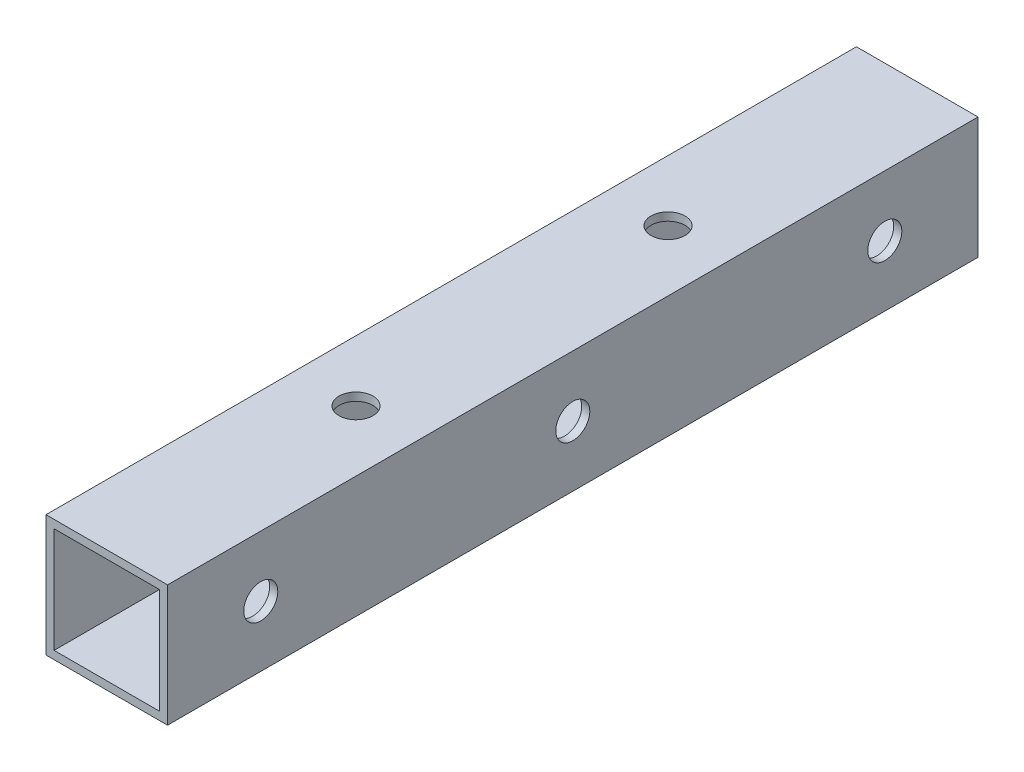
ISO-10303-21;
HEADER;
FILE_DESCRIPTION(('STEP AP214'),'2;1');
FILE_NAME('part.step','',(''),(''),'','','');
FILE_SCHEMA(('AUTOMOTIVE_DESIGN { 1 0 10303 214 1 1 1 1 }'));
ENDSEC;
DATA;
#1=APPLICATION_CONTEXT('core data for automotive mechanical design processes');
#2=APPLICATION_PROTOCOL_DEFINITION('international standard','automotive_design',2000,#1);
#3=PRODUCT_CONTEXT('',#1,'mechanical');
#4=PRODUCT('Part','Part','',(#3));
#5=PRODUCT_RELATED_PRODUCT_CATEGORY('part','',(#4));
#6=PRODUCT_DEFINITION_FORMATION('','',#4);
#7=PRODUCT_DEFINITION_CONTEXT('part definition',#1,'design');
#8=PRODUCT_DEFINITION('design','',#6,#7);
#9=PRODUCT_DEFINITION_SHAPE('','',#8);
#10=(LENGTH_UNIT() NAMED_UNIT(*) SI_UNIT(.MILLI.,.METRE.));
#11=(NAMED_UNIT(*) PLANE_ANGLE_UNIT() SI_UNIT($,.RADIAN.));
#12=(NAMED_UNIT(*) SI_UNIT($,.STERADIAN.) SOLID_ANGLE_UNIT());
#13=UNCERTAINTY_MEASURE_WITH_UNIT(LENGTH_MEASURE(1.E-05),#10,'distance_accuracy_value','');
#14=(GEOMETRIC_REPRESENTATION_CONTEXT(3) GLOBAL_UNCERTAINTY_ASSIGNED_CONTEXT((#13)) GLOBAL_UNIT_ASSIGNED_CONTEXT((#10,
#11,#12)) REPRESENTATION_CONTEXT('',''));
#15=CARTESIAN_POINT('',(0.,0.,0.));
#16=DIRECTION('',(0.,0.,1.));
#17=DIRECTION('',(1.,0.,0.));
#18=AXIS2_PLACEMENT_3D('',#15,#16,#17);
#19=CARTESIAN_POINT('',(0.,0.,100.));
#20=DIRECTION('',(0.,0.,1.));
#21=DIRECTION('',(1.,0.,0.));
#22=AXIS2_PLACEMENT_3D('',#19,#20,#21);
#23=PLANE('',#22);
#24=DIRECTION('',(0.,1.,0.));
#25=VECTOR('',#24,1.);
#26=CARTESIAN_POINT('',(7.5,7.5,100.));
#27=LINE('',#26,#25);
#28=CARTESIAN_POINT('',(7.5,-7.5,100.));
#29=VERTEX_POINT('',#28);
#30=CARTESIAN_POINT('',(7.5,7.5,100.));
#31=VERTEX_POINT('',#30);
#32=EDGE_CURVE('E146',#29,#31,#27,.T.);
#33=ORIENTED_EDGE('',*,*,#32,.T.);
#34=DIRECTION('',(-1.,0.,0.));
#35=VECTOR('',#34,1.);
#36=CARTESIAN_POINT('',(-7.5,7.5,100.));
#37=LINE('',#36,#35);
#38=CARTESIAN_POINT('',(-7.5,7.5,100.));
#39=VERTEX_POINT('',#38);
#40=EDGE_CURVE('E151',#31,#39,#37,.T.);
#41=ORIENTED_EDGE('',*,*,#40,.T.);
#42=DIRECTION('',(0.,-1.,0.));
#43=VECTOR('',#42,1.);
#44=CARTESIAN_POINT('',(-7.5,7.5,100.));
#45=LINE('',#44,#43);
#46=CARTESIAN_POINT('',(-7.5,-7.5,100.));
#47=VERTEX_POINT('',#46);
#48=EDGE_CURVE('E152',#39,#47,#45,.T.);
#49=ORIENTED_EDGE('',*,*,#48,.T.);
#50=DIRECTION('',(1.,0.,0.));
#51=VECTOR('',#50,1.);
#52=CARTESIAN_POINT('',(-7.5,-7.5,100.));
#53=LINE('',#52,#51);
#54=EDGE_CURVE('E156',#47,#29,#53,.T.);
#55=ORIENTED_EDGE('',*,*,#54,.T.);
#56=EDGE_LOOP('',(#33,#41,#49,#55));
#57=FACE_BOUND('',#56,.T.);
#58=DIRECTION('',(-1.,0.,0.));
#59=VECTOR('',#58,1.);
#60=CARTESIAN_POINT('',(-6.5,6.5,100.));
#61=LINE('',#60,#59);
#62=CARTESIAN_POINT('',(6.5,6.5,100.));
#63=VERTEX_POINT('',#62);
#64=CARTESIAN_POINT('',(-6.5,6.5,100.));
#65=VERTEX_POINT('',#64);
#66=EDGE_CURVE('E116',#63,#65,#61,.T.);
#67=ORIENTED_EDGE('',*,*,#66,.F.);
#68=DIRECTION('',(0.,1.,0.));
#69=VECTOR('',#68,1.);
#70=CARTESIAN_POINT('',(6.5,6.5,100.));
#71=LINE('',#70,#69);
#72=CARTESIAN_POINT('',(6.5,-6.5,100.));
#73=VERTEX_POINT('',#72);
#74=EDGE_CURVE('E109',#73,#63,#71,.T.);
#75=ORIENTED_EDGE('',*,*,#74,.F.);
#76=DIRECTION('',(1.,0.,0.));
#77=VECTOR('',#76,1.);
#78=CARTESIAN_POINT('',(-6.5,-6.5,100.));
#79=LINE('',#78,#77);
#80=CARTESIAN_POINT('',(-6.5,-6.5,100.));
#81=VERTEX_POINT('',#80);
#82=EDGE_CURVE('E135',#81,#73,#79,.T.);
#83=ORIENTED_EDGE('',*,*,#82,.F.);
#84=DIRECTION('',(0.,-1.,0.));
#85=VECTOR('',#84,1.);
#86=CARTESIAN_POINT('',(-6.5,6.5,100.));
#87=LINE('',#86,#85);
#88=EDGE_CURVE('E128',#65,#81,#87,.T.);
#89=ORIENTED_EDGE('',*,*,#88,.F.);
#90=EDGE_LOOP('',(#67,#75,#83,#89));
#91=FACE_BOUND('',#90,.T.);
#92=ADVANCED_FACE('F43',(#57,#91),#23,.T.);
#93=CARTESIAN_POINT('',(0.,0.,0.));
#94=DIRECTION('',(0.,0.,1.));
#95=DIRECTION('',(1.,0.,0.));
#96=AXIS2_PLACEMENT_3D('',#93,#94,#95);
#97=PLANE('',#96);
#98=DIRECTION('',(0.,1.,0.));
#99=VECTOR('',#98,1.);
#100=CARTESIAN_POINT('',(7.5,7.5,0.));
#101=LINE('',#100,#99);
#102=CARTESIAN_POINT('',(7.5,-7.5,0.));
#103=VERTEX_POINT('',#102);
#104=CARTESIAN_POINT('',(7.5,7.5,0.));
#105=VERTEX_POINT('',#104);
#106=EDGE_CURVE('E127',#103,#105,#101,.T.);
#107=ORIENTED_EDGE('',*,*,#106,.F.);
#108=DIRECTION('',(1.,0.,0.));
#109=VECTOR('',#108,1.);
#110=CARTESIAN_POINT('',(-7.5,-7.5,0.));
#111=LINE('',#110,#109);
#112=CARTESIAN_POINT('',(-7.5,-7.5,0.));
#113=VERTEX_POINT('',#112);
#114=EDGE_CURVE('E155',#113,#103,#111,.T.);
#115=ORIENTED_EDGE('',*,*,#114,.F.);
#116=DIRECTION('',(0.,-1.,0.));
#117=VECTOR('',#116,1.);
#118=CARTESIAN_POINT('',(-7.5,7.5,0.));
#119=LINE('',#118,#117);
#120=CARTESIAN_POINT('',(-7.5,7.5,0.));
#121=VERTEX_POINT('',#120);
#122=EDGE_CURVE('E162',#121,#113,#119,.T.);
#123=ORIENTED_EDGE('',*,*,#122,.F.);
#124=DIRECTION('',(-1.,0.,0.));
#125=VECTOR('',#124,1.);
#126=CARTESIAN_POINT('',(-7.5,7.5,0.));
#127=LINE('',#126,#125);
#128=EDGE_CURVE('E161',#105,#121,#127,.T.);
#129=ORIENTED_EDGE('',*,*,#128,.F.);
#130=EDGE_LOOP('',(#107,#115,#123,#129));
#131=FACE_BOUND('',#130,.T.);
#132=DIRECTION('',(0.,1.,0.));
#133=VECTOR('',#132,1.);
#134=CARTESIAN_POINT('',(6.5,6.5,0.));
#135=LINE('',#134,#133);
#136=CARTESIAN_POINT('',(6.5,-6.5,0.));
#137=VERTEX_POINT('',#136);
#138=CARTESIAN_POINT('',(6.5,6.5,0.));
#139=VERTEX_POINT('',#138);
#140=EDGE_CURVE('E68',#137,#139,#135,.T.);
#141=ORIENTED_EDGE('',*,*,#140,.T.);
#142=DIRECTION('',(-1.,0.,0.));
#143=VECTOR('',#142,1.);
#144=CARTESIAN_POINT('',(-6.5,6.5,0.));
#145=LINE('',#144,#143);
#146=CARTESIAN_POINT('',(-6.5,6.5,0.));
#147=VERTEX_POINT('',#146);
#148=EDGE_CURVE('E124',#139,#147,#145,.T.);
#149=ORIENTED_EDGE('',*,*,#148,.T.);
#150=DIRECTION('',(0.,-1.,0.));
#151=VECTOR('',#150,1.);
#152=CARTESIAN_POINT('',(-6.5,6.5,0.));
#153=LINE('',#152,#151);
#154=CARTESIAN_POINT('',(-6.5,-6.5,0.));
#155=VERTEX_POINT('',#154);
#156=EDGE_CURVE('E139',#147,#155,#153,.T.);
#157=ORIENTED_EDGE('',*,*,#156,.T.);
#158=DIRECTION('',(1.,0.,0.));
#159=VECTOR('',#158,1.);
#160=CARTESIAN_POINT('',(-6.5,-6.5,0.));
#161=LINE('',#160,#159);
#162=EDGE_CURVE('E119',#155,#137,#161,.T.);
#163=ORIENTED_EDGE('',*,*,#162,.T.);
#164=EDGE_LOOP('',(#141,#149,#157,#163));
#165=FACE_BOUND('',#164,.T.);
#166=ADVANCED_FACE('F258',(#131,#165),#97,.F.);
#167=CARTESIAN_POINT('',(7.5,7.5,100.));
#168=DIRECTION('',(-1.,0.,0.));
#169=DIRECTION('',(0.,-1.,0.));
#170=AXIS2_PLACEMENT_3D('',#167,#168,#169);
#171=PLANE('',#170);
#172=CARTESIAN_POINT('',(7.5,0.,11.5));
#173=DIRECTION('',(1.,0.,0.));
#174=DIRECTION('',(0.,1.,0.));
#175=AXIS2_PLACEMENT_3D('',#172,#173,#174);
#176=CIRCLE('',#175,2.1);
#177=CARTESIAN_POINT('',(7.5,2.10000000000001,11.5));
#178=VERTEX_POINT('',#177);
#179=EDGE_CURVE('E215',#178,#178,#176,.T.);
#180=ORIENTED_EDGE('',*,*,#179,.F.);
#181=EDGE_LOOP('',(#180));
#182=FACE_BOUND('',#181,.T.);
#183=CARTESIAN_POINT('',(7.5,0.,88.5));
#184=DIRECTION('',(1.,0.,0.));
#185=DIRECTION('',(0.,1.,0.));
#186=AXIS2_PLACEMENT_3D('',#183,#184,#185);
#187=CIRCLE('',#186,2.1);
#188=CARTESIAN_POINT('',(7.5,2.10000000000001,88.5));
#189=VERTEX_POINT('',#188);
#190=EDGE_CURVE('E213',#189,#189,#187,.T.);
#191=ORIENTED_EDGE('',*,*,#190,.F.);
#192=EDGE_LOOP('',(#191));
#193=FACE_BOUND('',#192,.T.);
#194=CARTESIAN_POINT('',(7.5,0.,50.));
#195=DIRECTION('',(1.,0.,0.));
#196=DIRECTION('',(0.,1.,0.));
#197=AXIS2_PLACEMENT_3D('',#194,#195,#196);
#198=CIRCLE('',#197,2.1);
#199=CARTESIAN_POINT('',(7.5,2.1,50.));
#200=VERTEX_POINT('',#199);
#201=EDGE_CURVE('E180',#200,#200,#198,.T.);
#202=ORIENTED_EDGE('',*,*,#201,.F.);
#203=EDGE_LOOP('',(#202));
#204=FACE_BOUND('',#203,.T.);
#205=ORIENTED_EDGE('',*,*,#106,.T.);
#206=DIRECTION('',(0.,0.,-1.));
#207=VECTOR('',#206,1.);
#208=CARTESIAN_POINT('',(7.5,7.5,100.));
#209=LINE('',#208,#207);
#210=EDGE_CURVE('E11',#31,#105,#209,.T.);
#211=ORIENTED_EDGE('',*,*,#210,.F.);
#212=ORIENTED_EDGE('',*,*,#32,.F.);
#213=DIRECTION('',(0.,0.,-1.));
#214=VECTOR('',#213,1.);
#215=CARTESIAN_POINT('',(7.5,-7.5,100.));
#216=LINE('',#215,#214);
#217=EDGE_CURVE('E158',#29,#103,#216,.T.);
#218=ORIENTED_EDGE('',*,*,#217,.T.);
#219=EDGE_LOOP('',(#205,#211,#212,#218));
#220=FACE_BOUND('',#219,.T.);
#221=ADVANCED_FACE('F44',(#182,#193,#204,#220),#171,.F.);
#222=CARTESIAN_POINT('',(-7.5,7.5,100.));
#223=DIRECTION('',(0.,-1.,0.));
#224=DIRECTION('',(0.,0.,-1.));
#225=AXIS2_PLACEMENT_3D('',#222,#223,#224);
#226=PLANE('',#225);
#227=CARTESIAN_POINT('',(0.,7.5,30.75));
#228=DIRECTION('',(0.,1.,0.));
#229=DIRECTION('',(0.,0.,1.));
#230=AXIS2_PLACEMENT_3D('',#227,#228,#229);
#231=CIRCLE('',#230,2.1);
#232=CARTESIAN_POINT('',(0.,7.5,32.85));
#233=VERTEX_POINT('',#232);
#234=EDGE_CURVE('E187',#233,#233,#231,.T.);
#235=ORIENTED_EDGE('',*,*,#234,.F.);
#236=EDGE_LOOP('',(#235));
#237=FACE_BOUND('',#236,.T.);
#238=CARTESIAN_POINT('',(0.,7.5,69.25));
#239=DIRECTION('',(0.,1.,0.));
#240=DIRECTION('',(0.,0.,1.));
#241=AXIS2_PLACEMENT_3D('',#238,#239,#240);
#242=CIRCLE('',#241,2.1);
#243=CARTESIAN_POINT('',(0.,7.5,71.35));
#244=VERTEX_POINT('',#243);
#245=EDGE_CURVE('E197',#244,#244,#242,.T.);
#246=ORIENTED_EDGE('',*,*,#245,.F.);
#247=EDGE_LOOP('',(#246));
#248=FACE_BOUND('',#247,.T.);
#249=ORIENTED_EDGE('',*,*,#128,.T.);
#250=DIRECTION('',(0.,0.,-1.));
#251=VECTOR('',#250,1.);
#252=CARTESIAN_POINT('',(-7.5,7.5,100.));
#253=LINE('',#252,#251);
#254=EDGE_CURVE('E55',#39,#121,#253,.T.);
#255=ORIENTED_EDGE('',*,*,#254,.F.);
#256=ORIENTED_EDGE('',*,*,#40,.F.);
#257=ORIENTED_EDGE('',*,*,#210,.T.);
#258=EDGE_LOOP('',(#249,#255,#256,#257));
#259=FACE_BOUND('',#258,.T.);
#260=ADVANCED_FACE('F275',(#237,#248,#259),#226,.F.);
#261=CARTESIAN_POINT('',(-7.5,7.5,100.));
#262=DIRECTION('',(1.,0.,0.));
#263=DIRECTION('',(0.,1.,0.));
#264=AXIS2_PLACEMENT_3D('',#261,#262,#263);
#265=PLANE('',#264);
#266=CARTESIAN_POINT('',(-7.50000000000001,0.,11.5));
#267=DIRECTION('',(1.,0.,0.));
#268=DIRECTION('',(0.,1.,0.));
#269=AXIS2_PLACEMENT_3D('',#266,#267,#268);
#270=CIRCLE('',#269,2.1);
#271=CARTESIAN_POINT('',(-7.50000000000001,2.10000000000001,11.5));
#272=VERTEX_POINT('',#271);
#273=EDGE_CURVE('E138',#272,#272,#270,.T.);
#274=ORIENTED_EDGE('',*,*,#273,.T.);
#275=EDGE_LOOP('',(#274));
#276=FACE_BOUND('',#275,.T.);
#277=CARTESIAN_POINT('',(-7.50000000000001,0.,88.5));
#278=DIRECTION('',(1.,0.,0.));
#279=DIRECTION('',(0.,1.,0.));
#280=AXIS2_PLACEMENT_3D('',#277,#278,#279);
#281=CIRCLE('',#280,2.1);
#282=CARTESIAN_POINT('',(-7.50000000000001,2.1,88.5));
#283=VERTEX_POINT('',#282);
#284=EDGE_CURVE('E188',#283,#283,#281,.T.);
#285=ORIENTED_EDGE('',*,*,#284,.T.);
#286=EDGE_LOOP('',(#285));
#287=FACE_BOUND('',#286,.T.);
#288=CARTESIAN_POINT('',(-7.50000000000001,0.,50.));
#289=DIRECTION('',(1.,0.,0.));
#290=DIRECTION('',(0.,1.,0.));
#291=AXIS2_PLACEMENT_3D('',#288,#289,#290);
#292=CIRCLE('',#291,2.1);
#293=CARTESIAN_POINT('',(-7.50000000000001,2.1,50.));
#294=VERTEX_POINT('',#293);
#295=EDGE_CURVE('E185',#294,#294,#292,.T.);
#296=ORIENTED_EDGE('',*,*,#295,.T.);
#297=EDGE_LOOP('',(#296));
#298=FACE_BOUND('',#297,.T.);
#299=ORIENTED_EDGE('',*,*,#122,.T.);
#300=DIRECTION('',(0.,0.,-1.));
#301=VECTOR('',#300,1.);
#302=CARTESIAN_POINT('',(-7.5,-7.5,100.));
#303=LINE('',#302,#301);
#304=EDGE_CURVE('E169',#47,#113,#303,.T.);
#305=ORIENTED_EDGE('',*,*,#304,.F.);
#306=ORIENTED_EDGE('',*,*,#48,.F.);
#307=ORIENTED_EDGE('',*,*,#254,.T.);
#308=EDGE_LOOP('',(#299,#305,#306,#307));
#309=FACE_BOUND('',#308,.T.);
#310=ADVANCED_FACE('F235',(#276,#287,#298,#309),#265,.F.);
#311=CARTESIAN_POINT('',(-7.5,-7.5,100.));
#312=DIRECTION('',(0.,1.,0.));
#313=DIRECTION('',(0.,0.,1.));
#314=AXIS2_PLACEMENT_3D('',#311,#312,#313);
#315=PLANE('',#314);
#316=CARTESIAN_POINT('',(0.,-7.5,30.75));
#317=DIRECTION('',(0.,1.,0.));
#318=DIRECTION('',(0.,0.,1.));
#319=AXIS2_PLACEMENT_3D('',#316,#317,#318);
#320=CIRCLE('',#319,2.1);
#321=CARTESIAN_POINT('',(0.,-7.5,32.85));
#322=VERTEX_POINT('',#321);
#323=EDGE_CURVE('E207',#322,#322,#320,.T.);
#324=ORIENTED_EDGE('',*,*,#323,.T.);
#325=EDGE_LOOP('',(#324));
#326=FACE_BOUND('',#325,.T.);
#327=CARTESIAN_POINT('',(0.,-7.5,69.25));
#328=DIRECTION('',(0.,1.,0.));
#329=DIRECTION('',(0.,0.,1.));
#330=AXIS2_PLACEMENT_3D('',#327,#328,#329);
#331=CIRCLE('',#330,2.1);
#332=CARTESIAN_POINT('',(0.,-7.5,71.35));
#333=VERTEX_POINT('',#332);
#334=EDGE_CURVE('E192',#333,#333,#331,.T.);
#335=ORIENTED_EDGE('',*,*,#334,.T.);
#336=EDGE_LOOP('',(#335));
#337=FACE_BOUND('',#336,.T.);
#338=ORIENTED_EDGE('',*,*,#114,.T.);
#339=ORIENTED_EDGE('',*,*,#217,.F.);
#340=ORIENTED_EDGE('',*,*,#54,.F.);
#341=ORIENTED_EDGE('',*,*,#304,.T.);
#342=EDGE_LOOP('',(#338,#339,#340,#341));
#343=FACE_BOUND('',#342,.T.);
#344=ADVANCED_FACE('F270',(#326,#337,#343),#315,.F.);
#345=CARTESIAN_POINT('',(6.5,6.5,100.));
#346=DIRECTION('',(-1.,0.,0.));
#347=DIRECTION('',(0.,0.,1.));
#348=AXIS2_PLACEMENT_3D('',#345,#346,#347);
#349=PLANE('',#348);
#350=CARTESIAN_POINT('',(6.50000000000001,0.,11.5));
#351=DIRECTION('',(-1.,0.,0.));
#352=DIRECTION('',(0.,0.,1.));
#353=AXIS2_PLACEMENT_3D('',#350,#351,#352);
#354=CIRCLE('',#353,2.1);
#355=CARTESIAN_POINT('',(6.50000000000001,0.,13.6));
#356=VERTEX_POINT('',#355);
#357=EDGE_CURVE('E183',#356,#356,#354,.T.);
#358=ORIENTED_EDGE('',*,*,#357,.F.);
#359=EDGE_LOOP('',(#358));
#360=FACE_BOUND('',#359,.T.);
#361=CARTESIAN_POINT('',(6.50000000000001,0.,88.5));
#362=DIRECTION('',(-1.,0.,0.));
#363=DIRECTION('',(0.,0.,1.));
#364=AXIS2_PLACEMENT_3D('',#361,#362,#363);
#365=CIRCLE('',#364,2.1);
#366=CARTESIAN_POINT('',(6.50000000000001,0.,90.6));
#367=VERTEX_POINT('',#366);
#368=EDGE_CURVE('E182',#367,#367,#365,.T.);
#369=ORIENTED_EDGE('',*,*,#368,.F.);
#370=EDGE_LOOP('',(#369));
#371=FACE_BOUND('',#370,.T.);
#372=CARTESIAN_POINT('',(6.50000000000001,0.,50.));
#373=DIRECTION('',(-1.,0.,0.));
#374=DIRECTION('',(0.,0.,1.));
#375=AXIS2_PLACEMENT_3D('',#372,#373,#374);
#376=CIRCLE('',#375,2.1);
#377=CARTESIAN_POINT('',(6.50000000000001,0.,52.1));
#378=VERTEX_POINT('',#377);
#379=EDGE_CURVE('E176',#378,#378,#376,.T.);
#380=ORIENTED_EDGE('',*,*,#379,.F.);
#381=EDGE_LOOP('',(#380));
#382=FACE_BOUND('',#381,.T.);
#383=ORIENTED_EDGE('',*,*,#140,.F.);
#384=DIRECTION('',(0.,0.,-1.));
#385=VECTOR('',#384,1.);
#386=CARTESIAN_POINT('',(6.5,-6.5,100.));
#387=LINE('',#386,#385);
#388=EDGE_CURVE('E111',#73,#137,#387,.T.);
#389=ORIENTED_EDGE('',*,*,#388,.F.);
#390=ORIENTED_EDGE('',*,*,#74,.T.);
#391=DIRECTION('',(0.,0.,-1.));
#392=VECTOR('',#391,1.);
#393=CARTESIAN_POINT('',(6.5,6.5,100.));
#394=LINE('',#393,#392);
#395=EDGE_CURVE('E114',#63,#139,#394,.T.);
#396=ORIENTED_EDGE('',*,*,#395,.T.);
#397=EDGE_LOOP('',(#383,#389,#390,#396));
#398=FACE_BOUND('',#397,.T.);
#399=ADVANCED_FACE('F115',(#360,#371,#382,#398),#349,.T.);
#400=CARTESIAN_POINT('',(-6.5,6.5,100.));
#401=DIRECTION('',(0.,-1.,0.));
#402=DIRECTION('',(0.,0.,-1.));
#403=AXIS2_PLACEMENT_3D('',#400,#401,#402);
#404=PLANE('',#403);
#405=CARTESIAN_POINT('',(0.,6.5,30.75));
#406=DIRECTION('',(0.,-1.,0.));
#407=DIRECTION('',(0.,0.,-1.));
#408=AXIS2_PLACEMENT_3D('',#405,#406,#407);
#409=CIRCLE('',#408,2.1);
#410=CARTESIAN_POINT('',(0.,6.5,28.65));
#411=VERTEX_POINT('',#410);
#412=EDGE_CURVE('E206',#411,#411,#409,.T.);
#413=ORIENTED_EDGE('',*,*,#412,.F.);
#414=EDGE_LOOP('',(#413));
#415=FACE_BOUND('',#414,.T.);
#416=CARTESIAN_POINT('',(0.,6.5,69.25));
#417=DIRECTION('',(0.,-1.,0.));
#418=DIRECTION('',(0.,0.,-1.));
#419=AXIS2_PLACEMENT_3D('',#416,#417,#418);
#420=CIRCLE('',#419,2.1);
#421=CARTESIAN_POINT('',(0.,6.5,67.15));
#422=VERTEX_POINT('',#421);
#423=EDGE_CURVE('E189',#422,#422,#420,.T.);
#424=ORIENTED_EDGE('',*,*,#423,.F.);
#425=EDGE_LOOP('',(#424));
#426=FACE_BOUND('',#425,.T.);
#427=ORIENTED_EDGE('',*,*,#148,.F.);
#428=ORIENTED_EDGE('',*,*,#395,.F.);
#429=ORIENTED_EDGE('',*,*,#66,.T.);
#430=DIRECTION('',(0.,0.,-1.));
#431=VECTOR('',#430,1.);
#432=CARTESIAN_POINT('',(-6.5,6.5,100.));
#433=LINE('',#432,#431);
#434=EDGE_CURVE('E130',#65,#147,#433,.T.);
#435=ORIENTED_EDGE('',*,*,#434,.T.);
#436=EDGE_LOOP('',(#427,#428,#429,#435));
#437=FACE_BOUND('',#436,.T.);
#438=ADVANCED_FACE('F125',(#415,#426,#437),#404,.T.);
#439=CARTESIAN_POINT('',(-6.5,6.5,100.));
#440=DIRECTION('',(1.,0.,0.));
#441=DIRECTION('',(0.,0.,-1.));
#442=AXIS2_PLACEMENT_3D('',#439,#440,#441);
#443=PLANE('',#442);
#444=CARTESIAN_POINT('',(-6.50000000000001,0.,11.5));
#445=DIRECTION('',(1.,0.,0.));
#446=DIRECTION('',(0.,0.,-1.));
#447=AXIS2_PLACEMENT_3D('',#444,#445,#446);
#448=CIRCLE('',#447,2.1);
#449=CARTESIAN_POINT('',(-6.50000000000001,0.,9.40000000000001));
#450=VERTEX_POINT('',#449);
#451=EDGE_CURVE('E181',#450,#450,#448,.T.);
#452=ORIENTED_EDGE('',*,*,#451,.F.);
#453=EDGE_LOOP('',(#452));
#454=FACE_BOUND('',#453,.T.);
#455=CARTESIAN_POINT('',(-6.50000000000001,0.,88.5));
#456=DIRECTION('',(1.,0.,0.));
#457=DIRECTION('',(0.,0.,-1.));
#458=AXIS2_PLACEMENT_3D('',#455,#456,#457);
#459=CIRCLE('',#458,2.1);
#460=CARTESIAN_POINT('',(-6.50000000000001,0.,86.4));
#461=VERTEX_POINT('',#460);
#462=EDGE_CURVE('E178',#461,#461,#459,.T.);
#463=ORIENTED_EDGE('',*,*,#462,.F.);
#464=EDGE_LOOP('',(#463));
#465=FACE_BOUND('',#464,.T.);
#466=CARTESIAN_POINT('',(-6.50000000000001,0.,50.));
#467=DIRECTION('',(1.,0.,0.));
#468=DIRECTION('',(0.,0.,-1.));
#469=AXIS2_PLACEMENT_3D('',#466,#467,#468);
#470=CIRCLE('',#469,2.1);
#471=CARTESIAN_POINT('',(-6.50000000000001,0.,47.9));
#472=VERTEX_POINT('',#471);
#473=EDGE_CURVE('E171',#472,#472,#470,.T.);
#474=ORIENTED_EDGE('',*,*,#473,.F.);
#475=EDGE_LOOP('',(#474));
#476=FACE_BOUND('',#475,.T.);
#477=ORIENTED_EDGE('',*,*,#156,.F.);
#478=ORIENTED_EDGE('',*,*,#434,.F.);
#479=ORIENTED_EDGE('',*,*,#88,.T.);
#480=DIRECTION('',(0.,0.,-1.));
#481=VECTOR('',#480,1.);
#482=CARTESIAN_POINT('',(-6.5,-6.5,100.));
#483=LINE('',#482,#481);
#484=EDGE_CURVE('E58',#81,#155,#483,.T.);
#485=ORIENTED_EDGE('',*,*,#484,.T.);
#486=EDGE_LOOP('',(#477,#478,#479,#485));
#487=FACE_BOUND('',#486,.T.);
#488=ADVANCED_FACE('F299',(#454,#465,#476,#487),#443,.T.);
#489=CARTESIAN_POINT('',(-6.5,-6.5,100.));
#490=DIRECTION('',(0.,1.,0.));
#491=DIRECTION('',(0.,0.,1.));
#492=AXIS2_PLACEMENT_3D('',#489,#490,#491);
#493=PLANE('',#492);
#494=CARTESIAN_POINT('',(0.,-6.5,30.75));
#495=DIRECTION('',(0.,1.,0.));
#496=DIRECTION('',(0.,0.,1.));
#497=AXIS2_PLACEMENT_3D('',#494,#495,#496);
#498=CIRCLE('',#497,2.1);
#499=CARTESIAN_POINT('',(0.,-6.5,32.85));
#500=VERTEX_POINT('',#499);
#501=EDGE_CURVE('E50',#500,#500,#498,.T.);
#502=ORIENTED_EDGE('',*,*,#501,.F.);
#503=EDGE_LOOP('',(#502));
#504=FACE_BOUND('',#503,.T.);
#505=CARTESIAN_POINT('',(0.,-6.5,69.25));
#506=DIRECTION('',(0.,1.,0.));
#507=DIRECTION('',(0.,0.,1.));
#508=AXIS2_PLACEMENT_3D('',#505,#506,#507);
#509=CIRCLE('',#508,2.1);
#510=CARTESIAN_POINT('',(0.,-6.5,71.35));
#511=VERTEX_POINT('',#510);
#512=EDGE_CURVE('E190',#511,#511,#509,.T.);
#513=ORIENTED_EDGE('',*,*,#512,.F.);
#514=EDGE_LOOP('',(#513));
#515=FACE_BOUND('',#514,.T.);
#516=ORIENTED_EDGE('',*,*,#162,.F.);
#517=ORIENTED_EDGE('',*,*,#484,.F.);
#518=ORIENTED_EDGE('',*,*,#82,.T.);
#519=ORIENTED_EDGE('',*,*,#388,.T.);
#520=EDGE_LOOP('',(#516,#517,#518,#519));
#521=FACE_BOUND('',#520,.T.);
#522=ADVANCED_FACE('F300',(#504,#515,#521),#493,.T.);
#523=CARTESIAN_POINT('',(-358.5,0.,50.));
#524=DIRECTION('',(1.,0.,0.));
#525=DIRECTION('',(0.,1.,0.));
#526=AXIS2_PLACEMENT_3D('',#523,#524,#525);
#527=CYLINDRICAL_SURFACE('',#526,2.1);
#528=ORIENTED_EDGE('',*,*,#473,.T.);
#529=EDGE_LOOP('',(#528));
#530=FACE_BOUND('',#529,.T.);
#531=ORIENTED_EDGE('',*,*,#295,.F.);
#532=EDGE_LOOP('',(#531));
#533=FACE_BOUND('',#532,.T.);
#534=ADVANCED_FACE('F247',(#530,#533),#527,.F.);
#535=CARTESIAN_POINT('',(-358.5,0.,88.5));
#536=DIRECTION('',(1.,0.,0.));
#537=DIRECTION('',(0.,1.,0.));
#538=AXIS2_PLACEMENT_3D('',#535,#536,#537);
#539=CYLINDRICAL_SURFACE('',#538,2.1);
#540=ORIENTED_EDGE('',*,*,#462,.T.);
#541=EDGE_LOOP('',(#540));
#542=FACE_BOUND('',#541,.T.);
#543=ORIENTED_EDGE('',*,*,#284,.F.);
#544=EDGE_LOOP('',(#543));
#545=FACE_BOUND('',#544,.T.);
#546=ADVANCED_FACE('F236',(#542,#545),#539,.F.);
#547=CARTESIAN_POINT('',(-358.5,0.,11.5));
#548=DIRECTION('',(1.,0.,0.));
#549=DIRECTION('',(0.,1.,0.));
#550=AXIS2_PLACEMENT_3D('',#547,#548,#549);
#551=CYLINDRICAL_SURFACE('',#550,2.1);
#552=ORIENTED_EDGE('',*,*,#451,.T.);
#553=EDGE_LOOP('',(#552));
#554=FACE_BOUND('',#553,.T.);
#555=ORIENTED_EDGE('',*,*,#273,.F.);
#556=EDGE_LOOP('',(#555));
#557=FACE_BOUND('',#556,.T.);
#558=ADVANCED_FACE('F234',(#554,#557),#551,.F.);
#559=ORIENTED_EDGE('',*,*,#379,.T.);
#560=EDGE_LOOP('',(#559));
#561=FACE_BOUND('',#560,.T.);
#562=ORIENTED_EDGE('',*,*,#201,.T.);
#563=EDGE_LOOP('',(#562));
#564=FACE_BOUND('',#563,.T.);
#565=ADVANCED_FACE('F240',(#561,#564),#527,.F.);
#566=ORIENTED_EDGE('',*,*,#368,.T.);
#567=EDGE_LOOP('',(#566));
#568=FACE_BOUND('',#567,.T.);
#569=ORIENTED_EDGE('',*,*,#190,.T.);
#570=EDGE_LOOP('',(#569));
#571=FACE_BOUND('',#570,.T.);
#572=ADVANCED_FACE('F246',(#568,#571),#539,.F.);
#573=ORIENTED_EDGE('',*,*,#357,.T.);
#574=EDGE_LOOP('',(#573));
#575=FACE_BOUND('',#574,.T.);
#576=ORIENTED_EDGE('',*,*,#179,.T.);
#577=EDGE_LOOP('',(#576));
#578=FACE_BOUND('',#577,.T.);
#579=ADVANCED_FACE('F243',(#575,#578),#551,.F.);
#580=CARTESIAN_POINT('',(0.,-47.5,69.25));
#581=DIRECTION('',(0.,1.,0.));
#582=DIRECTION('',(0.,0.,1.));
#583=AXIS2_PLACEMENT_3D('',#580,#581,#582);
#584=CYLINDRICAL_SURFACE('',#583,2.1);
#585=ORIENTED_EDGE('',*,*,#512,.T.);
#586=EDGE_LOOP('',(#585));
#587=FACE_BOUND('',#586,.T.);
#588=ORIENTED_EDGE('',*,*,#334,.F.);
#589=EDGE_LOOP('',(#588));
#590=FACE_BOUND('',#589,.T.);
#591=ADVANCED_FACE('F251',(#587,#590),#584,.F.);
#592=CARTESIAN_POINT('',(0.,-47.5,30.75));
#593=DIRECTION('',(0.,1.,0.));
#594=DIRECTION('',(0.,0.,1.));
#595=AXIS2_PLACEMENT_3D('',#592,#593,#594);
#596=CYLINDRICAL_SURFACE('',#595,2.1);
#597=ORIENTED_EDGE('',*,*,#501,.T.);
#598=EDGE_LOOP('',(#597));
#599=FACE_BOUND('',#598,.T.);
#600=ORIENTED_EDGE('',*,*,#323,.F.);
#601=EDGE_LOOP('',(#600));
#602=FACE_BOUND('',#601,.T.);
#603=ADVANCED_FACE('F326',(#599,#602),#596,.F.);
#604=ORIENTED_EDGE('',*,*,#423,.T.);
#605=EDGE_LOOP('',(#604));
#606=FACE_BOUND('',#605,.T.);
#607=ORIENTED_EDGE('',*,*,#245,.T.);
#608=EDGE_LOOP('',(#607));
#609=FACE_BOUND('',#608,.T.);
#610=ADVANCED_FACE('F325',(#606,#609),#584,.F.);
#611=ORIENTED_EDGE('',*,*,#412,.T.);
#612=EDGE_LOOP('',(#611));
#613=FACE_BOUND('',#612,.T.);
#614=ORIENTED_EDGE('',*,*,#234,.T.);
#615=EDGE_LOOP('',(#614));
#616=FACE_BOUND('',#615,.T.);
#617=ADVANCED_FACE('F324',(#613,#616),#596,.F.);
#618=CLOSED_SHELL('',(#92,#166,#221,#260,#310,#344,#399,#438,#488,#522,#534,#546,#558,#565,#572,
#579,#591,#603,#610,#617));
#619=MANIFOLD_SOLID_BREP('B2',#618);
#620=ADVANCED_BREP_SHAPE_REPRESENTATION('',(#18,#619),#14);
#621=SHAPE_DEFINITION_REPRESENTATION(#9,#620);
ENDSEC;
END-ISO-10303-21;
